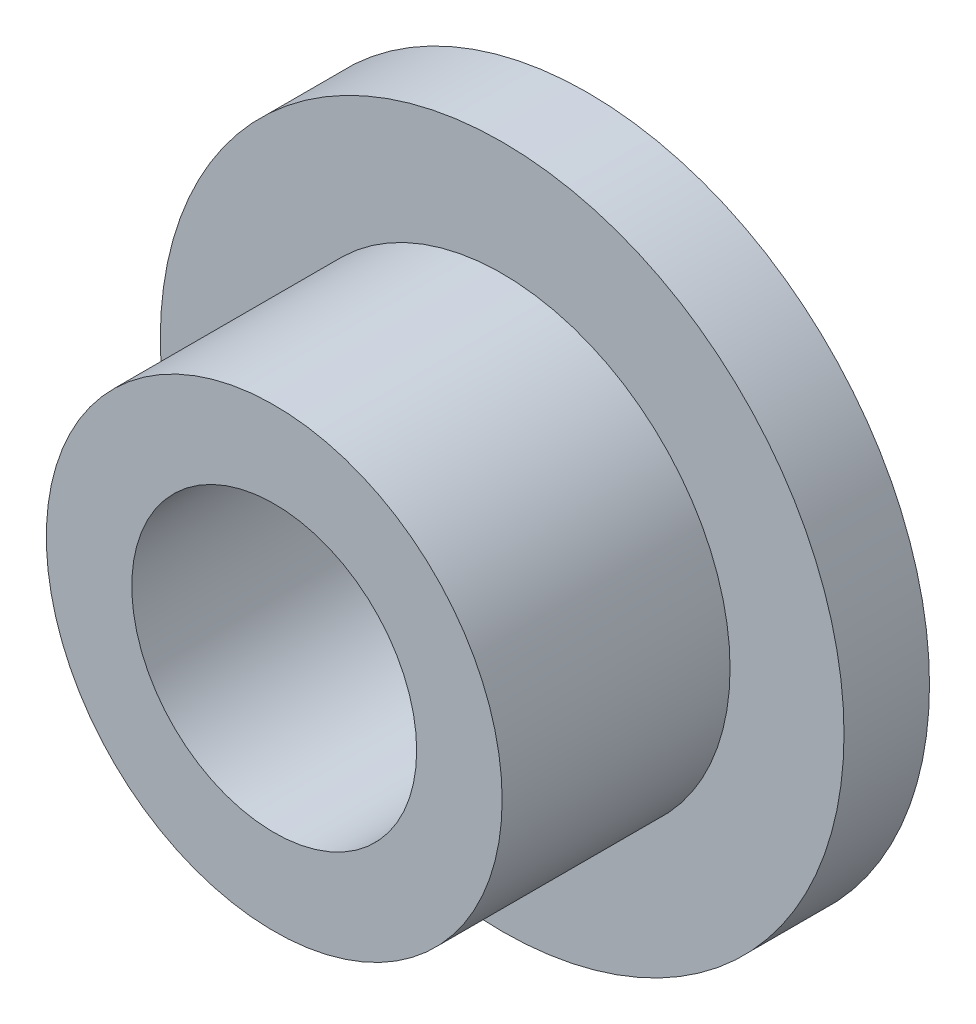
ISO-10303-21;
HEADER;
FILE_DESCRIPTION(('STEP AP214'),'2;1');
FILE_NAME('part.step','',(''),(''),'','','');
FILE_SCHEMA(('AUTOMOTIVE_DESIGN { 1 0 10303 214 1 1 1 1 }'));
ENDSEC;
DATA;
#1=APPLICATION_CONTEXT('core data for automotive mechanical design processes');
#2=APPLICATION_PROTOCOL_DEFINITION('international standard','automotive_design',2000,#1);
#3=PRODUCT_CONTEXT('',#1,'mechanical');
#4=PRODUCT('Part','Part','',(#3));
#5=PRODUCT_RELATED_PRODUCT_CATEGORY('part','',(#4));
#6=PRODUCT_DEFINITION_FORMATION('','',#4);
#7=PRODUCT_DEFINITION_CONTEXT('part definition',#1,'design');
#8=PRODUCT_DEFINITION('design','',#6,#7);
#9=PRODUCT_DEFINITION_SHAPE('','',#8);
#10=(LENGTH_UNIT() NAMED_UNIT(*) SI_UNIT(.MILLI.,.METRE.));
#11=(NAMED_UNIT(*) PLANE_ANGLE_UNIT() SI_UNIT($,.RADIAN.));
#12=(NAMED_UNIT(*) SI_UNIT($,.STERADIAN.) SOLID_ANGLE_UNIT());
#13=UNCERTAINTY_MEASURE_WITH_UNIT(LENGTH_MEASURE(1.E-05),#10,'distance_accuracy_value','');
#14=(GEOMETRIC_REPRESENTATION_CONTEXT(3) GLOBAL_UNCERTAINTY_ASSIGNED_CONTEXT((#13)) GLOBAL_UNIT_ASSIGNED_CONTEXT((#10,
#11,#12)) REPRESENTATION_CONTEXT('',''));
#15=CARTESIAN_POINT('',(0.,0.,0.));
#16=DIRECTION('',(0.,0.,1.));
#17=DIRECTION('',(1.,0.,0.));
#18=AXIS2_PLACEMENT_3D('',#15,#16,#17);
#19=CARTESIAN_POINT('',(0.,0.,1.5));
#20=DIRECTION('',(0.,0.,-1.));
#21=DIRECTION('',(-1.,0.,0.));
#22=AXIS2_PLACEMENT_3D('',#19,#20,#21);
#23=CYLINDRICAL_SURFACE('',#22,6.);
#24=CARTESIAN_POINT('',(0.,0.,1.5));
#25=DIRECTION('',(0.,0.,1.));
#26=DIRECTION('',(1.,0.,0.));
#27=AXIS2_PLACEMENT_3D('',#24,#25,#26);
#28=CIRCLE('',#27,6.);
#29=CARTESIAN_POINT('',(6.,0.,1.5));
#30=VERTEX_POINT('',#29);
#31=EDGE_CURVE('E10',#30,#30,#28,.T.);
#32=ORIENTED_EDGE('',*,*,#31,.F.);
#33=EDGE_LOOP('',(#32));
#34=FACE_BOUND('',#33,.T.);
#35=CARTESIAN_POINT('',(0.,0.,0.));
#36=DIRECTION('',(0.,0.,1.));
#37=DIRECTION('',(1.,0.,0.));
#38=AXIS2_PLACEMENT_3D('',#35,#36,#37);
#39=CIRCLE('',#38,6.);
#40=CARTESIAN_POINT('',(6.,0.,0.));
#41=VERTEX_POINT('',#40);
#42=EDGE_CURVE('E36',#41,#41,#39,.T.);
#43=ORIENTED_EDGE('',*,*,#42,.T.);
#44=EDGE_LOOP('',(#43));
#45=FACE_BOUND('',#44,.T.);
#46=ADVANCED_FACE('F33',(#34,#45),#23,.T.);
#47=CARTESIAN_POINT('',(0.,0.,1.5));
#48=DIRECTION('',(0.,0.,1.));
#49=DIRECTION('',(1.,0.,0.));
#50=AXIS2_PLACEMENT_3D('',#47,#48,#49);
#51=PLANE('',#50);
#52=CARTESIAN_POINT('',(0.,0.,1.5));
#53=DIRECTION('',(0.,0.,1.));
#54=DIRECTION('',(1.,0.,0.));
#55=AXIS2_PLACEMENT_3D('',#52,#53,#54);
#56=CIRCLE('',#55,4.);
#57=CARTESIAN_POINT('',(4.,0.,1.5));
#58=VERTEX_POINT('',#57);
#59=EDGE_CURVE('E40',#58,#58,#56,.T.);
#60=ORIENTED_EDGE('',*,*,#59,.F.);
#61=EDGE_LOOP('',(#60));
#62=FACE_BOUND('',#61,.T.);
#63=ORIENTED_EDGE('',*,*,#31,.T.);
#64=EDGE_LOOP('',(#63));
#65=FACE_BOUND('',#64,.T.);
#66=ADVANCED_FACE('F75',(#62,#65),#51,.T.);
#67=CARTESIAN_POINT('',(0.,0.,0.));
#68=DIRECTION('',(0.,0.,1.));
#69=DIRECTION('',(1.,0.,0.));
#70=AXIS2_PLACEMENT_3D('',#67,#68,#69);
#71=PLANE('',#70);
#72=ORIENTED_EDGE('',*,*,#42,.F.);
#73=EDGE_LOOP('',(#72));
#74=FACE_BOUND('',#73,.T.);
#75=CARTESIAN_POINT('',(0.,0.,0.));
#76=DIRECTION('',(0.,0.,1.));
#77=DIRECTION('',(1.,0.,0.));
#78=AXIS2_PLACEMENT_3D('',#75,#76,#77);
#79=CIRCLE('',#78,2.5);
#80=CARTESIAN_POINT('',(2.5,0.,0.));
#81=VERTEX_POINT('',#80);
#82=EDGE_CURVE('E46',#81,#81,#79,.T.);
#83=ORIENTED_EDGE('',*,*,#82,.T.);
#84=EDGE_LOOP('',(#83));
#85=FACE_BOUND('',#84,.T.);
#86=ADVANCED_FACE('F72',(#74,#85),#71,.F.);
#87=CARTESIAN_POINT('',(0.,0.,5.5));
#88=DIRECTION('',(0.,0.,-1.));
#89=DIRECTION('',(-1.,0.,0.));
#90=AXIS2_PLACEMENT_3D('',#87,#88,#89);
#91=CYLINDRICAL_SURFACE('',#90,2.5);
#92=CARTESIAN_POINT('',(0.,0.,5.5));
#93=DIRECTION('',(0.,0.,1.));
#94=DIRECTION('',(1.,0.,0.));
#95=AXIS2_PLACEMENT_3D('',#92,#93,#94);
#96=CIRCLE('',#95,2.5);
#97=CARTESIAN_POINT('',(2.5,0.,5.5));
#98=VERTEX_POINT('',#97);
#99=EDGE_CURVE('E49',#98,#98,#96,.T.);
#100=ORIENTED_EDGE('',*,*,#99,.T.);
#101=EDGE_LOOP('',(#100));
#102=FACE_BOUND('',#101,.T.);
#103=ORIENTED_EDGE('',*,*,#82,.F.);
#104=EDGE_LOOP('',(#103));
#105=FACE_BOUND('',#104,.T.);
#106=ADVANCED_FACE('F56',(#102,#105),#91,.F.);
#107=CARTESIAN_POINT('',(0.,0.,5.5));
#108=DIRECTION('',(0.,0.,-1.));
#109=DIRECTION('',(-1.,0.,0.));
#110=AXIS2_PLACEMENT_3D('',#107,#108,#109);
#111=CYLINDRICAL_SURFACE('',#110,4.);
#112=ORIENTED_EDGE('',*,*,#59,.T.);
#113=EDGE_LOOP('',(#112));
#114=FACE_BOUND('',#113,.T.);
#115=CARTESIAN_POINT('',(0.,0.,5.5));
#116=DIRECTION('',(0.,0.,1.));
#117=DIRECTION('',(1.,0.,0.));
#118=AXIS2_PLACEMENT_3D('',#115,#116,#117);
#119=CIRCLE('',#118,4.);
#120=CARTESIAN_POINT('',(4.,0.,5.5));
#121=VERTEX_POINT('',#120);
#122=EDGE_CURVE('E50',#121,#121,#119,.T.);
#123=ORIENTED_EDGE('',*,*,#122,.F.);
#124=EDGE_LOOP('',(#123));
#125=FACE_BOUND('',#124,.T.);
#126=ADVANCED_FACE('F62',(#114,#125),#111,.T.);
#127=CARTESIAN_POINT('',(0.,0.,5.5));
#128=DIRECTION('',(0.,0.,1.));
#129=DIRECTION('',(1.,0.,0.));
#130=AXIS2_PLACEMENT_3D('',#127,#128,#129);
#131=PLANE('',#130);
#132=ORIENTED_EDGE('',*,*,#99,.F.);
#133=EDGE_LOOP('',(#132));
#134=FACE_BOUND('',#133,.T.);
#135=ORIENTED_EDGE('',*,*,#122,.T.);
#136=EDGE_LOOP('',(#135));
#137=FACE_BOUND('',#136,.T.);
#138=ADVANCED_FACE('F59',(#134,#137),#131,.T.);
#139=CLOSED_SHELL('',(#46,#66,#86,#106,#126,#138));
#140=MANIFOLD_SOLID_BREP('B2',#139);
#141=ADVANCED_BREP_SHAPE_REPRESENTATION('',(#18,#140),#14);
#142=SHAPE_DEFINITION_REPRESENTATION(#9,#141);
ENDSEC;
END-ISO-10303-21;
